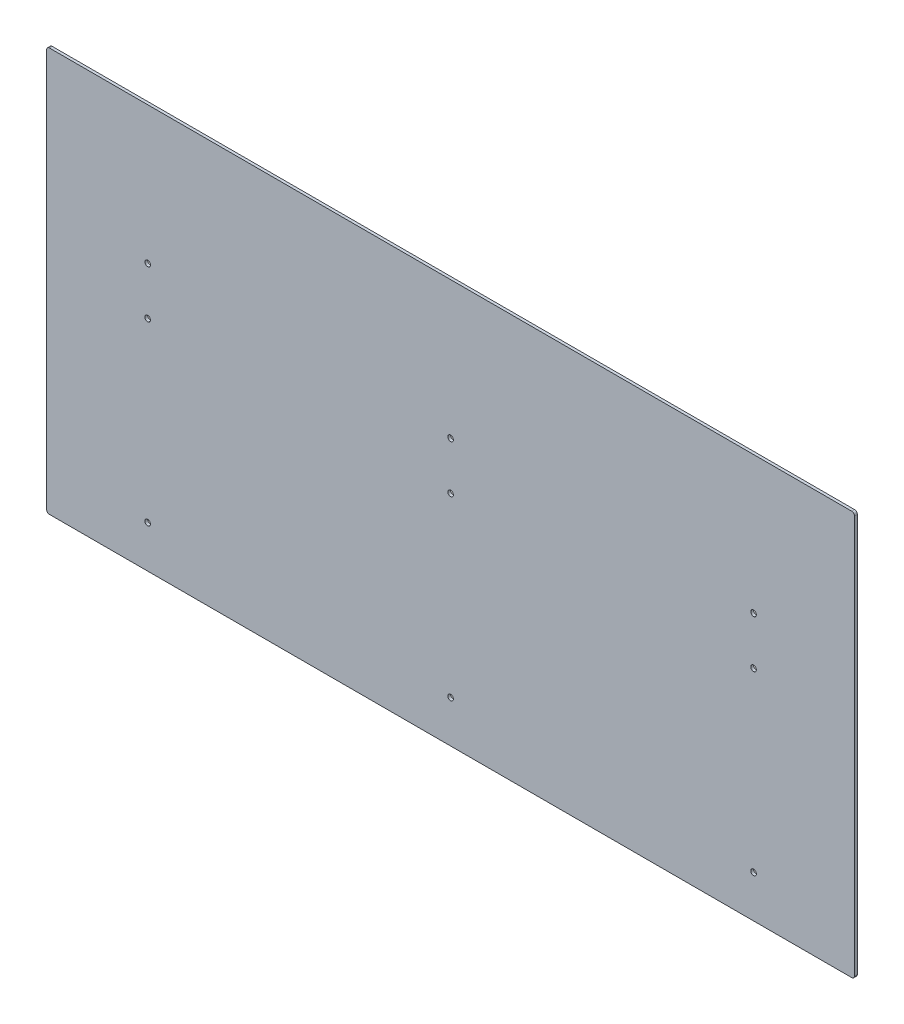
ISO-10303-21;
HEADER;
FILE_DESCRIPTION(('STEP AP214'),'2;1');
FILE_NAME('part.step','',(''),(''),'','','');
FILE_SCHEMA(('AUTOMOTIVE_DESIGN { 1 0 10303 214 1 1 1 1 }'));
ENDSEC;
DATA;
#1=APPLICATION_CONTEXT('core data for automotive mechanical design processes');
#2=APPLICATION_PROTOCOL_DEFINITION('international standard','automotive_design',2000,#1);
#3=PRODUCT_CONTEXT('',#1,'mechanical');
#4=PRODUCT('Part','Part','',(#3));
#5=PRODUCT_RELATED_PRODUCT_CATEGORY('part','',(#4));
#6=PRODUCT_DEFINITION_FORMATION('','',#4);
#7=PRODUCT_DEFINITION_CONTEXT('part definition',#1,'design');
#8=PRODUCT_DEFINITION('design','',#6,#7);
#9=PRODUCT_DEFINITION_SHAPE('','',#8);
#10=(LENGTH_UNIT() NAMED_UNIT(*) SI_UNIT(.MILLI.,.METRE.));
#11=(NAMED_UNIT(*) PLANE_ANGLE_UNIT() SI_UNIT($,.RADIAN.));
#12=(NAMED_UNIT(*) SI_UNIT($,.STERADIAN.) SOLID_ANGLE_UNIT());
#13=UNCERTAINTY_MEASURE_WITH_UNIT(LENGTH_MEASURE(1.E-05),#10,'distance_accuracy_value','');
#14=(GEOMETRIC_REPRESENTATION_CONTEXT(3) GLOBAL_UNCERTAINTY_ASSIGNED_CONTEXT((#13)) GLOBAL_UNIT_ASSIGNED_CONTEXT((#10,
#11,#12)) REPRESENTATION_CONTEXT('',''));
#15=CARTESIAN_POINT('',(0.,0.,0.));
#16=DIRECTION('',(0.,0.,1.));
#17=DIRECTION('',(1.,0.,0.));
#18=AXIS2_PLACEMENT_3D('',#15,#16,#17);
#19=CARTESIAN_POINT('',(0.,0.,3.175));
#20=DIRECTION('',(1.,0.,0.));
#21=DIRECTION('',(0.,0.,-1.));
#22=AXIS2_PLACEMENT_3D('',#19,#20,#21);
#23=PLANE('',#22);
#24=DIRECTION('',(0.,-1.,0.));
#25=VECTOR('',#24,1.);
#26=CARTESIAN_POINT('',(0.,0.,0.));
#27=LINE('',#26,#25);
#28=CARTESIAN_POINT('',(0.,454.025,0.));
#29=VERTEX_POINT('',#28);
#30=CARTESIAN_POINT('',(0.,3.175,0.));
#31=VERTEX_POINT('',#30);
#32=EDGE_CURVE('E197',#29,#31,#27,.T.);
#33=ORIENTED_EDGE('',*,*,#32,.T.);
#34=DIRECTION('',(0.,0.,-1.));
#35=VECTOR('',#34,1.);
#36=CARTESIAN_POINT('',(0.,3.175,3.175));
#37=LINE('',#36,#35);
#38=CARTESIAN_POINT('',(0.,3.175,3.175));
#39=VERTEX_POINT('',#38);
#40=EDGE_CURVE('E11',#31,#39,#37,.F.);
#41=ORIENTED_EDGE('',*,*,#40,.T.);
#42=DIRECTION('',(0.,-1.,0.));
#43=VECTOR('',#42,1.);
#44=CARTESIAN_POINT('',(0.,0.,3.175));
#45=LINE('',#44,#43);
#46=CARTESIAN_POINT('',(0.,454.025,3.175));
#47=VERTEX_POINT('',#46);
#48=EDGE_CURVE('E146',#47,#39,#45,.T.);
#49=ORIENTED_EDGE('',*,*,#48,.F.);
#50=DIRECTION('',(0.,0.,-1.));
#51=VECTOR('',#50,1.);
#52=CARTESIAN_POINT('',(0.,454.025,3.175));
#53=LINE('',#52,#51);
#54=EDGE_CURVE('E55',#47,#29,#53,.T.);
#55=ORIENTED_EDGE('',*,*,#54,.T.);
#56=EDGE_LOOP('',(#33,#41,#49,#55));
#57=FACE_BOUND('',#56,.T.);
#58=ADVANCED_FACE('F46',(#57),#23,.F.);
#59=CARTESIAN_POINT('',(0.,0.,3.175));
#60=DIRECTION('',(0.,1.,0.));
#61=DIRECTION('',(0.,0.,1.));
#62=AXIS2_PLACEMENT_3D('',#59,#60,#61);
#63=PLANE('',#62);
#64=DIRECTION('',(1.,0.,0.));
#65=VECTOR('',#64,1.);
#66=CARTESIAN_POINT('',(0.,0.,0.));
#67=LINE('',#66,#65);
#68=CARTESIAN_POINT('',(3.175,0.,0.));
#69=VERTEX_POINT('',#68);
#70=CARTESIAN_POINT('',(911.225,0.,0.));
#71=VERTEX_POINT('',#70);
#72=EDGE_CURVE('E155',#69,#71,#67,.T.);
#73=ORIENTED_EDGE('',*,*,#72,.T.);
#74=DIRECTION('',(0.,0.,-1.));
#75=VECTOR('',#74,1.);
#76=CARTESIAN_POINT('',(911.225,0.,3.175));
#77=LINE('',#76,#75);
#78=CARTESIAN_POINT('',(911.225,0.,3.175));
#79=VERTEX_POINT('',#78);
#80=EDGE_CURVE('E65',#71,#79,#77,.F.);
#81=ORIENTED_EDGE('',*,*,#80,.T.);
#82=DIRECTION('',(1.,0.,0.));
#83=VECTOR('',#82,1.);
#84=CARTESIAN_POINT('',(0.,0.,3.175));
#85=LINE('',#84,#83);
#86=CARTESIAN_POINT('',(3.175,0.,3.175));
#87=VERTEX_POINT('',#86);
#88=EDGE_CURVE('E152',#87,#79,#85,.T.);
#89=ORIENTED_EDGE('',*,*,#88,.F.);
#90=DIRECTION('',(0.,0.,-1.));
#91=VECTOR('',#90,1.);
#92=CARTESIAN_POINT('',(3.175,0.,3.175));
#93=LINE('',#92,#91);
#94=EDGE_CURVE('E184',#87,#69,#93,.T.);
#95=ORIENTED_EDGE('',*,*,#94,.T.);
#96=EDGE_LOOP('',(#73,#81,#89,#95));
#97=FACE_BOUND('',#96,.T.);
#98=ADVANCED_FACE('F316',(#97),#63,.F.);
#99=CARTESIAN_POINT('',(914.4,0.,3.175));
#100=DIRECTION('',(-1.,0.,0.));
#101=DIRECTION('',(0.,0.,1.));
#102=AXIS2_PLACEMENT_3D('',#99,#100,#101);
#103=PLANE('',#102);
#104=DIRECTION('',(0.,1.,0.));
#105=VECTOR('',#104,1.);
#106=CARTESIAN_POINT('',(914.4,0.,0.));
#107=LINE('',#106,#105);
#108=CARTESIAN_POINT('',(914.4,3.175,0.));
#109=VERTEX_POINT('',#108);
#110=CARTESIAN_POINT('',(914.4,454.025,0.));
#111=VERTEX_POINT('',#110);
#112=EDGE_CURVE('E147',#109,#111,#107,.T.);
#113=ORIENTED_EDGE('',*,*,#112,.T.);
#114=DIRECTION('',(0.,0.,-1.));
#115=VECTOR('',#114,1.);
#116=CARTESIAN_POINT('',(914.4,454.025,3.175));
#117=LINE('',#116,#115);
#118=CARTESIAN_POINT('',(914.4,454.025,3.175));
#119=VERTEX_POINT('',#118);
#120=EDGE_CURVE('E122',#111,#119,#117,.F.);
#121=ORIENTED_EDGE('',*,*,#120,.T.);
#122=DIRECTION('',(0.,1.,0.));
#123=VECTOR('',#122,1.);
#124=CARTESIAN_POINT('',(914.4,0.,3.175));
#125=LINE('',#124,#123);
#126=CARTESIAN_POINT('',(914.4,3.175,3.175));
#127=VERTEX_POINT('',#126);
#128=EDGE_CURVE('E214',#127,#119,#125,.T.);
#129=ORIENTED_EDGE('',*,*,#128,.F.);
#130=DIRECTION('',(0.,0.,-1.));
#131=VECTOR('',#130,1.);
#132=CARTESIAN_POINT('',(914.4,3.175,3.175));
#133=LINE('',#132,#131);
#134=EDGE_CURVE('E128',#127,#109,#133,.T.);
#135=ORIENTED_EDGE('',*,*,#134,.T.);
#136=EDGE_LOOP('',(#113,#121,#129,#135));
#137=FACE_BOUND('',#136,.T.);
#138=ADVANCED_FACE('F313',(#137),#103,.F.);
#139=CARTESIAN_POINT('',(0.,457.2,3.175));
#140=DIRECTION('',(0.,-1.,0.));
#141=DIRECTION('',(0.,0.,-1.));
#142=AXIS2_PLACEMENT_3D('',#139,#140,#141);
#143=PLANE('',#142);
#144=DIRECTION('',(-1.,0.,0.));
#145=VECTOR('',#144,1.);
#146=CARTESIAN_POINT('',(0.,457.2,3.175));
#147=LINE('',#146,#145);
#148=CARTESIAN_POINT('',(911.225,457.2,3.175));
#149=VERTEX_POINT('',#148);
#150=CARTESIAN_POINT('',(3.175,457.2,3.175));
#151=VERTEX_POINT('',#150);
#152=EDGE_CURVE('E138',#149,#151,#147,.T.);
#153=ORIENTED_EDGE('',*,*,#152,.F.);
#154=DIRECTION('',(0.,0.,-1.));
#155=VECTOR('',#154,1.);
#156=CARTESIAN_POINT('',(911.225,457.2,3.175));
#157=LINE('',#156,#155);
#158=CARTESIAN_POINT('',(911.225,457.2,0.));
#159=VERTEX_POINT('',#158);
#160=EDGE_CURVE('E121',#149,#159,#157,.T.);
#161=ORIENTED_EDGE('',*,*,#160,.T.);
#162=DIRECTION('',(-1.,0.,0.));
#163=VECTOR('',#162,1.);
#164=CARTESIAN_POINT('',(0.,457.2,0.));
#165=LINE('',#164,#163);
#166=CARTESIAN_POINT('',(3.175,457.2,0.));
#167=VERTEX_POINT('',#166);
#168=EDGE_CURVE('E135',#159,#167,#165,.T.);
#169=ORIENTED_EDGE('',*,*,#168,.T.);
#170=DIRECTION('',(0.,0.,-1.));
#171=VECTOR('',#170,1.);
#172=CARTESIAN_POINT('',(3.175,457.2,3.175));
#173=LINE('',#172,#171);
#174=EDGE_CURVE('E141',#167,#151,#173,.F.);
#175=ORIENTED_EDGE('',*,*,#174,.T.);
#176=EDGE_LOOP('',(#153,#161,#169,#175));
#177=FACE_BOUND('',#176,.T.);
#178=ADVANCED_FACE('F134',(#177),#143,.F.);
#179=CARTESIAN_POINT('',(0.,0.,3.175));
#180=DIRECTION('',(0.,0.,-1.));
#181=DIRECTION('',(-1.,0.,0.));
#182=AXIS2_PLACEMENT_3D('',#179,#180,#181);
#183=PLANE('',#182);
#184=CARTESIAN_POINT('',(114.3,247.65,3.175));
#185=DIRECTION('',(0.,0.,1.));
#186=DIRECTION('',(1.,0.,0.));
#187=AXIS2_PLACEMENT_3D('',#184,#185,#186);
#188=CIRCLE('',#187,3.175);
#189=CARTESIAN_POINT('',(117.475,247.65,3.175));
#190=VERTEX_POINT('',#189);
#191=EDGE_CURVE('E282',#190,#190,#188,.T.);
#192=ORIENTED_EDGE('',*,*,#191,.F.);
#193=EDGE_LOOP('',(#192));
#194=FACE_BOUND('',#193,.T.);
#195=CARTESIAN_POINT('',(114.3,301.625,3.175));
#196=DIRECTION('',(0.,0.,1.));
#197=DIRECTION('',(1.,0.,0.));
#198=AXIS2_PLACEMENT_3D('',#195,#196,#197);
#199=CIRCLE('',#198,3.175);
#200=CARTESIAN_POINT('',(117.475,301.625,3.175));
#201=VERTEX_POINT('',#200);
#202=EDGE_CURVE('E274',#201,#201,#199,.T.);
#203=ORIENTED_EDGE('',*,*,#202,.F.);
#204=EDGE_LOOP('',(#203));
#205=FACE_BOUND('',#204,.T.);
#206=CARTESIAN_POINT('',(457.2,301.625,3.175));
#207=DIRECTION('',(0.,0.,1.));
#208=DIRECTION('',(1.,0.,0.));
#209=AXIS2_PLACEMENT_3D('',#206,#207,#208);
#210=CIRCLE('',#209,3.17499999999998);
#211=CARTESIAN_POINT('',(460.375,301.625,3.175));
#212=VERTEX_POINT('',#211);
#213=EDGE_CURVE('E266',#212,#212,#210,.T.);
#214=ORIENTED_EDGE('',*,*,#213,.F.);
#215=EDGE_LOOP('',(#214));
#216=FACE_BOUND('',#215,.T.);
#217=CARTESIAN_POINT('',(457.2,247.65,3.175));
#218=DIRECTION('',(0.,0.,1.));
#219=DIRECTION('',(1.,0.,0.));
#220=AXIS2_PLACEMENT_3D('',#217,#218,#219);
#221=CIRCLE('',#220,3.17499999999998);
#222=CARTESIAN_POINT('',(460.375,247.65,3.175));
#223=VERTEX_POINT('',#222);
#224=EDGE_CURVE('E258',#223,#223,#221,.T.);
#225=ORIENTED_EDGE('',*,*,#224,.F.);
#226=EDGE_LOOP('',(#225));
#227=FACE_BOUND('',#226,.T.);
#228=CARTESIAN_POINT('',(800.1,247.65,3.175));
#229=DIRECTION('',(0.,0.,1.));
#230=DIRECTION('',(1.,0.,0.));
#231=AXIS2_PLACEMENT_3D('',#228,#229,#230);
#232=CIRCLE('',#231,3.17500000000004);
#233=CARTESIAN_POINT('',(803.275,247.65,3.175));
#234=VERTEX_POINT('',#233);
#235=EDGE_CURVE('E250',#234,#234,#232,.T.);
#236=ORIENTED_EDGE('',*,*,#235,.F.);
#237=EDGE_LOOP('',(#236));
#238=FACE_BOUND('',#237,.T.);
#239=CARTESIAN_POINT('',(800.1,301.625,3.175));
#240=DIRECTION('',(0.,0.,1.));
#241=DIRECTION('',(1.,0.,0.));
#242=AXIS2_PLACEMENT_3D('',#239,#240,#241);
#243=CIRCLE('',#242,3.17500000000004);
#244=CARTESIAN_POINT('',(803.275,301.625,3.175));
#245=VERTEX_POINT('',#244);
#246=EDGE_CURVE('E242',#245,#245,#243,.T.);
#247=ORIENTED_EDGE('',*,*,#246,.F.);
#248=EDGE_LOOP('',(#247));
#249=FACE_BOUND('',#248,.T.);
#250=CARTESIAN_POINT('',(114.3,47.6249999999997,3.175));
#251=DIRECTION('',(0.,0.,1.));
#252=DIRECTION('',(1.,0.,0.));
#253=AXIS2_PLACEMENT_3D('',#250,#251,#252);
#254=CIRCLE('',#253,3.175);
#255=CARTESIAN_POINT('',(117.475,47.6249999999997,3.175));
#256=VERTEX_POINT('',#255);
#257=EDGE_CURVE('E234',#256,#256,#254,.T.);
#258=ORIENTED_EDGE('',*,*,#257,.F.);
#259=EDGE_LOOP('',(#258));
#260=FACE_BOUND('',#259,.T.);
#261=CARTESIAN_POINT('',(457.2,47.6249999999998,3.175));
#262=DIRECTION('',(0.,0.,1.));
#263=DIRECTION('',(1.,0.,0.));
#264=AXIS2_PLACEMENT_3D('',#261,#262,#263);
#265=CIRCLE('',#264,3.17499999999998);
#266=CARTESIAN_POINT('',(460.375,47.6249999999998,3.175));
#267=VERTEX_POINT('',#266);
#268=EDGE_CURVE('E226',#267,#267,#265,.T.);
#269=ORIENTED_EDGE('',*,*,#268,.F.);
#270=EDGE_LOOP('',(#269));
#271=FACE_BOUND('',#270,.T.);
#272=CARTESIAN_POINT('',(800.1,47.6249999999998,3.175));
#273=DIRECTION('',(0.,0.,1.));
#274=DIRECTION('',(1.,0.,0.));
#275=AXIS2_PLACEMENT_3D('',#272,#273,#274);
#276=CIRCLE('',#275,3.17500000000004);
#277=CARTESIAN_POINT('',(803.275,47.6249999999998,3.175));
#278=VERTEX_POINT('',#277);
#279=EDGE_CURVE('E210',#278,#278,#276,.T.);
#280=ORIENTED_EDGE('',*,*,#279,.F.);
#281=EDGE_LOOP('',(#280));
#282=FACE_BOUND('',#281,.T.);
#283=ORIENTED_EDGE('',*,*,#128,.T.);
#284=CARTESIAN_POINT('',(911.225,454.025,3.175));
#285=DIRECTION('',(0.,0.,-1.));
#286=DIRECTION('',(-1.,0.,0.));
#287=AXIS2_PLACEMENT_3D('',#284,#285,#286);
#288=CIRCLE('',#287,3.175);
#289=EDGE_CURVE('E181',#119,#149,#288,.F.);
#290=ORIENTED_EDGE('',*,*,#289,.T.);
#291=ORIENTED_EDGE('',*,*,#152,.T.);
#292=CARTESIAN_POINT('',(3.175,454.025,3.175));
#293=DIRECTION('',(0.,0.,-1.));
#294=DIRECTION('',(-1.,0.,0.));
#295=AXIS2_PLACEMENT_3D('',#292,#293,#294);
#296=CIRCLE('',#295,3.175);
#297=EDGE_CURVE('E173',#151,#47,#296,.F.);
#298=ORIENTED_EDGE('',*,*,#297,.T.);
#299=ORIENTED_EDGE('',*,*,#48,.T.);
#300=CARTESIAN_POINT('',(3.175,3.175,3.175));
#301=DIRECTION('',(0.,0.,-1.));
#302=DIRECTION('',(-1.,0.,0.));
#303=AXIS2_PLACEMENT_3D('',#300,#301,#302);
#304=CIRCLE('',#303,3.175);
#305=EDGE_CURVE('E72',#39,#87,#304,.F.);
#306=ORIENTED_EDGE('',*,*,#305,.T.);
#307=ORIENTED_EDGE('',*,*,#88,.T.);
#308=CARTESIAN_POINT('',(911.225,3.175,3.175));
#309=DIRECTION('',(0.,0.,-1.));
#310=DIRECTION('',(-1.,0.,0.));
#311=AXIS2_PLACEMENT_3D('',#308,#309,#310);
#312=CIRCLE('',#311,3.175);
#313=EDGE_CURVE('E178',#79,#127,#312,.F.);
#314=ORIENTED_EDGE('',*,*,#313,.T.);
#315=EDGE_LOOP('',(#283,#290,#291,#298,#299,#306,#307,#314));
#316=FACE_BOUND('',#315,.T.);
#317=ADVANCED_FACE('F290',(#194,#205,#216,#227,#238,#249,#260,#271,#282,#316),#183,.F.);
#318=CARTESIAN_POINT('',(0.,0.,0.));
#319=DIRECTION('',(0.,0.,-1.));
#320=DIRECTION('',(-1.,0.,0.));
#321=AXIS2_PLACEMENT_3D('',#318,#319,#320);
#322=PLANE('',#321);
#323=CARTESIAN_POINT('',(114.3,247.65,0.));
#324=DIRECTION('',(0.,0.,1.));
#325=DIRECTION('',(1.,0.,0.));
#326=AXIS2_PLACEMENT_3D('',#323,#324,#325);
#327=CIRCLE('',#326,3.175);
#328=CARTESIAN_POINT('',(117.475,247.65,0.));
#329=VERTEX_POINT('',#328);
#330=EDGE_CURVE('E278',#329,#329,#327,.T.);
#331=ORIENTED_EDGE('',*,*,#330,.T.);
#332=EDGE_LOOP('',(#331));
#333=FACE_BOUND('',#332,.T.);
#334=CARTESIAN_POINT('',(114.3,301.625,0.));
#335=DIRECTION('',(0.,0.,1.));
#336=DIRECTION('',(1.,0.,0.));
#337=AXIS2_PLACEMENT_3D('',#334,#335,#336);
#338=CIRCLE('',#337,3.175);
#339=CARTESIAN_POINT('',(117.475,301.625,0.));
#340=VERTEX_POINT('',#339);
#341=EDGE_CURVE('E270',#340,#340,#338,.T.);
#342=ORIENTED_EDGE('',*,*,#341,.T.);
#343=EDGE_LOOP('',(#342));
#344=FACE_BOUND('',#343,.T.);
#345=CARTESIAN_POINT('',(457.2,301.625,0.));
#346=DIRECTION('',(0.,0.,1.));
#347=DIRECTION('',(1.,0.,0.));
#348=AXIS2_PLACEMENT_3D('',#345,#346,#347);
#349=CIRCLE('',#348,3.17499999999998);
#350=CARTESIAN_POINT('',(460.375,301.625,0.));
#351=VERTEX_POINT('',#350);
#352=EDGE_CURVE('E262',#351,#351,#349,.T.);
#353=ORIENTED_EDGE('',*,*,#352,.T.);
#354=EDGE_LOOP('',(#353));
#355=FACE_BOUND('',#354,.T.);
#356=CARTESIAN_POINT('',(457.2,247.65,0.));
#357=DIRECTION('',(0.,0.,1.));
#358=DIRECTION('',(1.,0.,0.));
#359=AXIS2_PLACEMENT_3D('',#356,#357,#358);
#360=CIRCLE('',#359,3.17499999999998);
#361=CARTESIAN_POINT('',(460.375,247.65,0.));
#362=VERTEX_POINT('',#361);
#363=EDGE_CURVE('E254',#362,#362,#360,.T.);
#364=ORIENTED_EDGE('',*,*,#363,.T.);
#365=EDGE_LOOP('',(#364));
#366=FACE_BOUND('',#365,.T.);
#367=CARTESIAN_POINT('',(800.1,247.65,0.));
#368=DIRECTION('',(0.,0.,1.));
#369=DIRECTION('',(1.,0.,0.));
#370=AXIS2_PLACEMENT_3D('',#367,#368,#369);
#371=CIRCLE('',#370,3.17500000000004);
#372=CARTESIAN_POINT('',(803.275,247.65,0.));
#373=VERTEX_POINT('',#372);
#374=EDGE_CURVE('E246',#373,#373,#371,.T.);
#375=ORIENTED_EDGE('',*,*,#374,.T.);
#376=EDGE_LOOP('',(#375));
#377=FACE_BOUND('',#376,.T.);
#378=CARTESIAN_POINT('',(800.1,301.625,0.));
#379=DIRECTION('',(0.,0.,1.));
#380=DIRECTION('',(1.,0.,0.));
#381=AXIS2_PLACEMENT_3D('',#378,#379,#380);
#382=CIRCLE('',#381,3.17500000000004);
#383=CARTESIAN_POINT('',(803.275,301.625,0.));
#384=VERTEX_POINT('',#383);
#385=EDGE_CURVE('E238',#384,#384,#382,.T.);
#386=ORIENTED_EDGE('',*,*,#385,.T.);
#387=EDGE_LOOP('',(#386));
#388=FACE_BOUND('',#387,.T.);
#389=CARTESIAN_POINT('',(114.3,47.6249999999997,0.));
#390=DIRECTION('',(0.,0.,1.));
#391=DIRECTION('',(1.,0.,0.));
#392=AXIS2_PLACEMENT_3D('',#389,#390,#391);
#393=CIRCLE('',#392,3.175);
#394=CARTESIAN_POINT('',(117.475,47.6249999999997,0.));
#395=VERTEX_POINT('',#394);
#396=EDGE_CURVE('E230',#395,#395,#393,.T.);
#397=ORIENTED_EDGE('',*,*,#396,.T.);
#398=EDGE_LOOP('',(#397));
#399=FACE_BOUND('',#398,.T.);
#400=CARTESIAN_POINT('',(457.2,47.6249999999998,0.));
#401=DIRECTION('',(0.,0.,1.));
#402=DIRECTION('',(1.,0.,0.));
#403=AXIS2_PLACEMENT_3D('',#400,#401,#402);
#404=CIRCLE('',#403,3.17499999999998);
#405=CARTESIAN_POINT('',(460.375,47.6249999999998,0.));
#406=VERTEX_POINT('',#405);
#407=EDGE_CURVE('E223',#406,#406,#404,.T.);
#408=ORIENTED_EDGE('',*,*,#407,.T.);
#409=EDGE_LOOP('',(#408));
#410=FACE_BOUND('',#409,.T.);
#411=CARTESIAN_POINT('',(800.1,47.6249999999998,0.));
#412=DIRECTION('',(0.,0.,1.));
#413=DIRECTION('',(1.,0.,0.));
#414=AXIS2_PLACEMENT_3D('',#411,#412,#413);
#415=CIRCLE('',#414,3.17500000000004);
#416=CARTESIAN_POINT('',(803.275,47.6249999999998,0.));
#417=VERTEX_POINT('',#416);
#418=EDGE_CURVE('E203',#417,#417,#415,.T.);
#419=ORIENTED_EDGE('',*,*,#418,.T.);
#420=EDGE_LOOP('',(#419));
#421=FACE_BOUND('',#420,.T.);
#422=ORIENTED_EDGE('',*,*,#168,.F.);
#423=CARTESIAN_POINT('',(911.225,454.025,0.));
#424=DIRECTION('',(0.,0.,-1.));
#425=DIRECTION('',(-1.,0.,0.));
#426=AXIS2_PLACEMENT_3D('',#423,#424,#425);
#427=CIRCLE('',#426,3.175);
#428=EDGE_CURVE('E117',#159,#111,#427,.T.);
#429=ORIENTED_EDGE('',*,*,#428,.T.);
#430=ORIENTED_EDGE('',*,*,#112,.F.);
#431=CARTESIAN_POINT('',(911.225,3.175,0.));
#432=DIRECTION('',(0.,0.,-1.));
#433=DIRECTION('',(-1.,0.,0.));
#434=AXIS2_PLACEMENT_3D('',#431,#432,#433);
#435=CIRCLE('',#434,3.175);
#436=EDGE_CURVE('E129',#109,#71,#435,.T.);
#437=ORIENTED_EDGE('',*,*,#436,.T.);
#438=ORIENTED_EDGE('',*,*,#72,.F.);
#439=CARTESIAN_POINT('',(3.175,3.175,0.));
#440=DIRECTION('',(0.,0.,-1.));
#441=DIRECTION('',(-1.,0.,0.));
#442=AXIS2_PLACEMENT_3D('',#439,#440,#441);
#443=CIRCLE('',#442,3.175);
#444=EDGE_CURVE('E163',#69,#31,#443,.T.);
#445=ORIENTED_EDGE('',*,*,#444,.T.);
#446=ORIENTED_EDGE('',*,*,#32,.F.);
#447=CARTESIAN_POINT('',(3.175,454.025,0.));
#448=DIRECTION('',(0.,0.,-1.));
#449=DIRECTION('',(-1.,0.,0.));
#450=AXIS2_PLACEMENT_3D('',#447,#448,#449);
#451=CIRCLE('',#450,3.175);
#452=EDGE_CURVE('E140',#29,#167,#451,.T.);
#453=ORIENTED_EDGE('',*,*,#452,.T.);
#454=EDGE_LOOP('',(#422,#429,#430,#437,#438,#445,#446,#453));
#455=FACE_BOUND('',#454,.T.);
#456=ADVANCED_FACE('F143',(#333,#344,#355,#366,#377,#388,#399,#410,#421,#455),#322,.T.);
#457=CARTESIAN_POINT('',(800.1,47.6249999999998,3.175));
#458=DIRECTION('',(0.,0.,1.));
#459=DIRECTION('',(1.,0.,0.));
#460=AXIS2_PLACEMENT_3D('',#457,#458,#459);
#461=CYLINDRICAL_SURFACE('',#460,3.17500000000004);
#462=ORIENTED_EDGE('',*,*,#418,.F.);
#463=EDGE_LOOP('',(#462));
#464=FACE_BOUND('',#463,.T.);
#465=ORIENTED_EDGE('',*,*,#279,.T.);
#466=EDGE_LOOP('',(#465));
#467=FACE_BOUND('',#466,.T.);
#468=ADVANCED_FACE('F442',(#464,#467),#461,.F.);
#469=CARTESIAN_POINT('',(457.2,47.6249999999998,3.175));
#470=DIRECTION('',(0.,0.,1.));
#471=DIRECTION('',(1.,0.,0.));
#472=AXIS2_PLACEMENT_3D('',#469,#470,#471);
#473=CYLINDRICAL_SURFACE('',#472,3.17499999999998);
#474=ORIENTED_EDGE('',*,*,#407,.F.);
#475=EDGE_LOOP('',(#474));
#476=FACE_BOUND('',#475,.T.);
#477=ORIENTED_EDGE('',*,*,#268,.T.);
#478=EDGE_LOOP('',(#477));
#479=FACE_BOUND('',#478,.T.);
#480=ADVANCED_FACE('F432',(#476,#479),#473,.F.);
#481=CARTESIAN_POINT('',(114.3,47.6249999999997,3.175));
#482=DIRECTION('',(0.,0.,1.));
#483=DIRECTION('',(1.,0.,0.));
#484=AXIS2_PLACEMENT_3D('',#481,#482,#483);
#485=CYLINDRICAL_SURFACE('',#484,3.175);
#486=ORIENTED_EDGE('',*,*,#396,.F.);
#487=EDGE_LOOP('',(#486));
#488=FACE_BOUND('',#487,.T.);
#489=ORIENTED_EDGE('',*,*,#257,.T.);
#490=EDGE_LOOP('',(#489));
#491=FACE_BOUND('',#490,.T.);
#492=ADVANCED_FACE('F422',(#488,#491),#485,.F.);
#493=CARTESIAN_POINT('',(800.1,301.625,3.175));
#494=DIRECTION('',(0.,0.,1.));
#495=DIRECTION('',(1.,0.,0.));
#496=AXIS2_PLACEMENT_3D('',#493,#494,#495);
#497=CYLINDRICAL_SURFACE('',#496,3.17500000000004);
#498=ORIENTED_EDGE('',*,*,#385,.F.);
#499=EDGE_LOOP('',(#498));
#500=FACE_BOUND('',#499,.T.);
#501=ORIENTED_EDGE('',*,*,#246,.T.);
#502=EDGE_LOOP('',(#501));
#503=FACE_BOUND('',#502,.T.);
#504=ADVANCED_FACE('F412',(#500,#503),#497,.F.);
#505=CARTESIAN_POINT('',(800.1,247.65,3.175));
#506=DIRECTION('',(0.,0.,1.));
#507=DIRECTION('',(1.,0.,0.));
#508=AXIS2_PLACEMENT_3D('',#505,#506,#507);
#509=CYLINDRICAL_SURFACE('',#508,3.17500000000004);
#510=ORIENTED_EDGE('',*,*,#374,.F.);
#511=EDGE_LOOP('',(#510));
#512=FACE_BOUND('',#511,.T.);
#513=ORIENTED_EDGE('',*,*,#235,.T.);
#514=EDGE_LOOP('',(#513));
#515=FACE_BOUND('',#514,.T.);
#516=ADVANCED_FACE('F402',(#512,#515),#509,.F.);
#517=CARTESIAN_POINT('',(457.2,247.65,3.175));
#518=DIRECTION('',(0.,0.,1.));
#519=DIRECTION('',(1.,0.,0.));
#520=AXIS2_PLACEMENT_3D('',#517,#518,#519);
#521=CYLINDRICAL_SURFACE('',#520,3.17499999999998);
#522=ORIENTED_EDGE('',*,*,#363,.F.);
#523=EDGE_LOOP('',(#522));
#524=FACE_BOUND('',#523,.T.);
#525=ORIENTED_EDGE('',*,*,#224,.T.);
#526=EDGE_LOOP('',(#525));
#527=FACE_BOUND('',#526,.T.);
#528=ADVANCED_FACE('F392',(#524,#527),#521,.F.);
#529=CARTESIAN_POINT('',(457.2,301.625,3.175));
#530=DIRECTION('',(0.,0.,1.));
#531=DIRECTION('',(1.,0.,0.));
#532=AXIS2_PLACEMENT_3D('',#529,#530,#531);
#533=CYLINDRICAL_SURFACE('',#532,3.17499999999998);
#534=ORIENTED_EDGE('',*,*,#352,.F.);
#535=EDGE_LOOP('',(#534));
#536=FACE_BOUND('',#535,.T.);
#537=ORIENTED_EDGE('',*,*,#213,.T.);
#538=EDGE_LOOP('',(#537));
#539=FACE_BOUND('',#538,.T.);
#540=ADVANCED_FACE('F382',(#536,#539),#533,.F.);
#541=CARTESIAN_POINT('',(114.3,301.625,3.175));
#542=DIRECTION('',(0.,0.,1.));
#543=DIRECTION('',(1.,0.,0.));
#544=AXIS2_PLACEMENT_3D('',#541,#542,#543);
#545=CYLINDRICAL_SURFACE('',#544,3.175);
#546=ORIENTED_EDGE('',*,*,#341,.F.);
#547=EDGE_LOOP('',(#546));
#548=FACE_BOUND('',#547,.T.);
#549=ORIENTED_EDGE('',*,*,#202,.T.);
#550=EDGE_LOOP('',(#549));
#551=FACE_BOUND('',#550,.T.);
#552=ADVANCED_FACE('F371',(#548,#551),#545,.F.);
#553=CARTESIAN_POINT('',(114.3,247.65,3.175));
#554=DIRECTION('',(0.,0.,1.));
#555=DIRECTION('',(1.,0.,0.));
#556=AXIS2_PLACEMENT_3D('',#553,#554,#555);
#557=CYLINDRICAL_SURFACE('',#556,3.175);
#558=ORIENTED_EDGE('',*,*,#330,.F.);
#559=EDGE_LOOP('',(#558));
#560=FACE_BOUND('',#559,.T.);
#561=ORIENTED_EDGE('',*,*,#191,.T.);
#562=EDGE_LOOP('',(#561));
#563=FACE_BOUND('',#562,.T.);
#564=ADVANCED_FACE('F288',(#560,#563),#557,.F.);
#565=CARTESIAN_POINT('',(911.225,454.025,3.175));
#566=DIRECTION('',(0.,0.,-1.));
#567=DIRECTION('',(-1.,0.,0.));
#568=AXIS2_PLACEMENT_3D('',#565,#566,#567);
#569=CYLINDRICAL_SURFACE('',#568,3.175);
#570=ORIENTED_EDGE('',*,*,#289,.F.);
#571=ORIENTED_EDGE('',*,*,#120,.F.);
#572=ORIENTED_EDGE('',*,*,#428,.F.);
#573=ORIENTED_EDGE('',*,*,#160,.F.);
#574=EDGE_LOOP('',(#570,#571,#572,#573));
#575=FACE_BOUND('',#574,.T.);
#576=ADVANCED_FACE('F120',(#575),#569,.T.);
#577=CARTESIAN_POINT('',(911.225,3.175,3.175));
#578=DIRECTION('',(0.,0.,-1.));
#579=DIRECTION('',(-1.,0.,0.));
#580=AXIS2_PLACEMENT_3D('',#577,#578,#579);
#581=CYLINDRICAL_SURFACE('',#580,3.175);
#582=ORIENTED_EDGE('',*,*,#313,.F.);
#583=ORIENTED_EDGE('',*,*,#80,.F.);
#584=ORIENTED_EDGE('',*,*,#436,.F.);
#585=ORIENTED_EDGE('',*,*,#134,.F.);
#586=EDGE_LOOP('',(#582,#583,#584,#585));
#587=FACE_BOUND('',#586,.T.);
#588=ADVANCED_FACE('F315',(#587),#581,.T.);
#589=CARTESIAN_POINT('',(3.175,3.175,3.175));
#590=DIRECTION('',(0.,0.,-1.));
#591=DIRECTION('',(-1.,0.,0.));
#592=AXIS2_PLACEMENT_3D('',#589,#590,#591);
#593=CYLINDRICAL_SURFACE('',#592,3.175);
#594=ORIENTED_EDGE('',*,*,#305,.F.);
#595=ORIENTED_EDGE('',*,*,#40,.F.);
#596=ORIENTED_EDGE('',*,*,#444,.F.);
#597=ORIENTED_EDGE('',*,*,#94,.F.);
#598=EDGE_LOOP('',(#594,#595,#596,#597));
#599=FACE_BOUND('',#598,.T.);
#600=ADVANCED_FACE('F319',(#599),#593,.T.);
#601=CARTESIAN_POINT('',(3.175,454.025,3.175));
#602=DIRECTION('',(0.,0.,-1.));
#603=DIRECTION('',(-1.,0.,0.));
#604=AXIS2_PLACEMENT_3D('',#601,#602,#603);
#605=CYLINDRICAL_SURFACE('',#604,3.175);
#606=ORIENTED_EDGE('',*,*,#297,.F.);
#607=ORIENTED_EDGE('',*,*,#174,.F.);
#608=ORIENTED_EDGE('',*,*,#452,.F.);
#609=ORIENTED_EDGE('',*,*,#54,.F.);
#610=EDGE_LOOP('',(#606,#607,#608,#609));
#611=FACE_BOUND('',#610,.T.);
#612=ADVANCED_FACE('F48',(#611),#605,.T.);
#613=CLOSED_SHELL('',(#58,#98,#138,#178,#317,#456,#468,#480,#492,#504,#516,#528,#540,#552,#564,
#576,#588,#600,#612));
#614=MANIFOLD_SOLID_BREP('B2',#613);
#615=ADVANCED_BREP_SHAPE_REPRESENTATION('',(#18,#614),#14);
#616=SHAPE_DEFINITION_REPRESENTATION(#9,#615);
ENDSEC;
END-ISO-10303-21;
